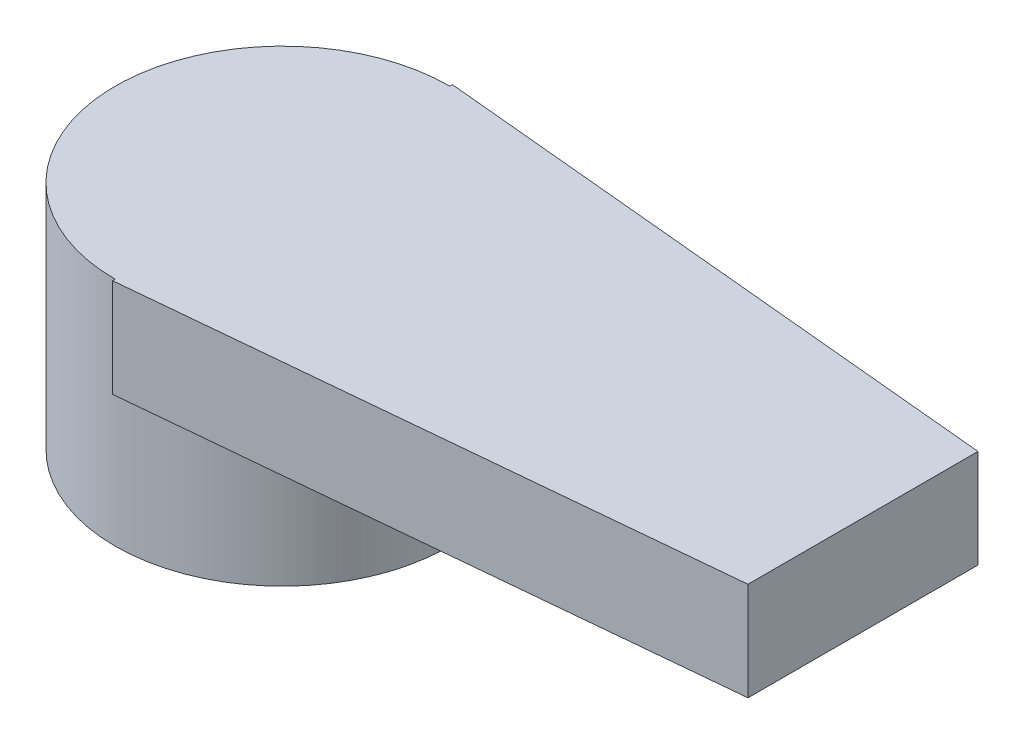
ISO-10303-21;
HEADER;
FILE_DESCRIPTION(('STEP AP214'),'2;1');
FILE_NAME('part.step','',(''),(''),'','','');
FILE_SCHEMA(('AUTOMOTIVE_DESIGN { 1 0 10303 214 1 1 1 1 }'));
ENDSEC;
DATA;
#1=APPLICATION_CONTEXT('core data for automotive mechanical design processes');
#2=APPLICATION_PROTOCOL_DEFINITION('international standard','automotive_design',2000,#1);
#3=PRODUCT_CONTEXT('',#1,'mechanical');
#4=PRODUCT('Part','Part','',(#3));
#5=PRODUCT_RELATED_PRODUCT_CATEGORY('part','',(#4));
#6=PRODUCT_DEFINITION_FORMATION('','',#4);
#7=PRODUCT_DEFINITION_CONTEXT('part definition',#1,'design');
#8=PRODUCT_DEFINITION('design','',#6,#7);
#9=PRODUCT_DEFINITION_SHAPE('','',#8);
#10=(LENGTH_UNIT() NAMED_UNIT(*) SI_UNIT(.MILLI.,.METRE.));
#11=(NAMED_UNIT(*) PLANE_ANGLE_UNIT() SI_UNIT($,.RADIAN.));
#12=(NAMED_UNIT(*) SI_UNIT($,.STERADIAN.) SOLID_ANGLE_UNIT());
#13=UNCERTAINTY_MEASURE_WITH_UNIT(LENGTH_MEASURE(1.E-05),#10,'distance_accuracy_value','');
#14=(GEOMETRIC_REPRESENTATION_CONTEXT(3) GLOBAL_UNCERTAINTY_ASSIGNED_CONTEXT((#13)) GLOBAL_UNIT_ASSIGNED_CONTEXT((#10,
#11,#12)) REPRESENTATION_CONTEXT('',''));
#15=CARTESIAN_POINT('',(0.,0.,0.));
#16=DIRECTION('',(0.,0.,1.));
#17=DIRECTION('',(1.,0.,0.));
#18=AXIS2_PLACEMENT_3D('',#15,#16,#17);
#19=CARTESIAN_POINT('',(0.,21.65,0.));
#20=DIRECTION('',(0.,-1.,0.));
#21=DIRECTION('',(0.,0.,-1.));
#22=AXIS2_PLACEMENT_3D('',#19,#20,#21);
#23=CYLINDRICAL_SURFACE('',#22,3.4);
#24=CARTESIAN_POINT('',(0.,16.95,0.));
#25=DIRECTION('',(0.,1.,0.));
#26=DIRECTION('',(0.,0.,1.));
#27=AXIS2_PLACEMENT_3D('',#24,#25,#26);
#28=CIRCLE('',#27,3.4);
#29=CARTESIAN_POINT('',(0.,16.95,3.4));
#30=VERTEX_POINT('',#29);
#31=EDGE_CURVE('E125',#30,#30,#28,.T.);
#32=ORIENTED_EDGE('',*,*,#31,.T.);
#33=EDGE_LOOP('',(#32));
#34=FACE_BOUND('',#33,.T.);
#35=DIRECTION('',(0.,-1.,0.));
#36=VECTOR('',#35,1.);
#37=CARTESIAN_POINT('',(0.,21.65,3.4));
#38=LINE('',#37,#36);
#39=CARTESIAN_POINT('',(0.,21.65,3.4));
#40=VERTEX_POINT('',#39);
#41=CARTESIAN_POINT('',(0.,19.65,3.4));
#42=VERTEX_POINT('',#41);
#43=EDGE_CURVE('E117',#40,#42,#38,.T.);
#44=ORIENTED_EDGE('',*,*,#43,.F.);
#45=CARTESIAN_POINT('',(0.,21.65,0.));
#46=DIRECTION('',(0.,1.,0.));
#47=DIRECTION('',(0.,0.,1.));
#48=AXIS2_PLACEMENT_3D('',#45,#46,#47);
#49=CIRCLE('',#48,3.4);
#50=CARTESIAN_POINT('',(0.,21.65,-3.4));
#51=VERTEX_POINT('',#50);
#52=EDGE_CURVE('E47',#51,#40,#49,.T.);
#53=ORIENTED_EDGE('',*,*,#52,.F.);
#54=DIRECTION('',(0.,-1.,0.));
#55=VECTOR('',#54,1.);
#56=CARTESIAN_POINT('',(0.,21.65,-3.4));
#57=LINE('',#56,#55);
#58=CARTESIAN_POINT('',(0.,19.65,-3.4));
#59=VERTEX_POINT('',#58);
#60=EDGE_CURVE('E113',#59,#51,#57,.F.);
#61=ORIENTED_EDGE('',*,*,#60,.F.);
#62=CARTESIAN_POINT('',(0.,19.65,0.));
#63=DIRECTION('',(0.,-1.,0.));
#64=DIRECTION('',(0.,0.,-1.));
#65=AXIS2_PLACEMENT_3D('',#62,#63,#64);
#66=CIRCLE('',#65,3.4);
#67=EDGE_CURVE('E11',#59,#42,#66,.T.);
#68=ORIENTED_EDGE('',*,*,#67,.T.);
#69=EDGE_LOOP('',(#44,#53,#61,#68));
#70=FACE_BOUND('',#69,.T.);
#71=ADVANCED_FACE('F39',(#34,#70),#23,.T.);
#72=CARTESIAN_POINT('',(0.,21.65,0.));
#73=DIRECTION('',(0.,1.,0.));
#74=DIRECTION('',(0.,0.,1.));
#75=AXIS2_PLACEMENT_3D('',#72,#73,#74);
#76=PLANE('',#75);
#77=ORIENTED_EDGE('',*,*,#52,.T.);
#78=DIRECTION('',(0.,0.,1.));
#79=VECTOR('',#78,1.);
#80=CARTESIAN_POINT('',(0.,21.65,3.45311618846922));
#81=LINE('',#80,#79);
#82=CARTESIAN_POINT('',(0.,21.65,3.45311618846922));
#83=VERTEX_POINT('',#82);
#84=EDGE_CURVE('E61',#40,#83,#81,.T.);
#85=ORIENTED_EDGE('',*,*,#84,.T.);
#86=DIRECTION('',(0.99556196460308,0.,-0.0941083133185143));
#87=VECTOR('',#86,1.);
#88=CARTESIAN_POINT('',(11.8,21.65,2.33768778055369));
#89=LINE('',#88,#87);
#90=CARTESIAN_POINT('',(11.8,21.65,2.33768778055369));
#91=VERTEX_POINT('',#90);
#92=EDGE_CURVE('E93',#83,#91,#89,.T.);
#93=ORIENTED_EDGE('',*,*,#92,.T.);
#94=DIRECTION('',(0.,0.,-1.));
#95=VECTOR('',#94,1.);
#96=CARTESIAN_POINT('',(11.8,21.65,-2.33768778055369));
#97=LINE('',#96,#95);
#98=CARTESIAN_POINT('',(11.8,21.65,-2.33768778055369));
#99=VERTEX_POINT('',#98);
#100=EDGE_CURVE('E109',#91,#99,#97,.T.);
#101=ORIENTED_EDGE('',*,*,#100,.T.);
#102=DIRECTION('',(-0.99556196460308,0.,-0.0941083133185143));
#103=VECTOR('',#102,1.);
#104=CARTESIAN_POINT('',(0.,21.65,-3.45311618846922));
#105=LINE('',#104,#103);
#106=CARTESIAN_POINT('',(0.,21.65,-3.45311618846922));
#107=VERTEX_POINT('',#106);
#108=EDGE_CURVE('E244',#99,#107,#105,.T.);
#109=ORIENTED_EDGE('',*,*,#108,.T.);
#110=EDGE_CURVE('E98',#107,#51,#81,.T.);
#111=ORIENTED_EDGE('',*,*,#110,.T.);
#112=EDGE_LOOP('',(#77,#85,#93,#101,#109,#111));
#113=FACE_BOUND('',#112,.T.);
#114=ADVANCED_FACE('F92',(#113),#76,.T.);
#115=CARTESIAN_POINT('',(0.,16.95,0.));
#116=DIRECTION('',(0.,1.,0.));
#117=DIRECTION('',(0.,0.,1.));
#118=AXIS2_PLACEMENT_3D('',#115,#116,#117);
#119=PLANE('',#118);
#120=CARTESIAN_POINT('',(0.,16.95,0.));
#121=DIRECTION('',(0.,1.,0.));
#122=DIRECTION('',(0.,0.,1.));
#123=AXIS2_PLACEMENT_3D('',#120,#121,#122);
#124=CIRCLE('',#123,2.45);
#125=CARTESIAN_POINT('',(0.,16.95,2.45));
#126=VERTEX_POINT('',#125);
#127=EDGE_CURVE('E236',#126,#126,#124,.T.);
#128=ORIENTED_EDGE('',*,*,#127,.T.);
#129=EDGE_LOOP('',(#128));
#130=FACE_BOUND('',#129,.T.);
#131=ORIENTED_EDGE('',*,*,#31,.F.);
#132=EDGE_LOOP('',(#131));
#133=FACE_BOUND('',#132,.T.);
#134=ADVANCED_FACE('F133',(#130,#133),#119,.F.);
#135=CARTESIAN_POINT('',(0.,21.65,3.45311618846922));
#136=DIRECTION('',(1.,0.,0.));
#137=DIRECTION('',(0.,0.,-1.));
#138=AXIS2_PLACEMENT_3D('',#135,#136,#137);
#139=PLANE('',#138);
#140=ORIENTED_EDGE('',*,*,#84,.F.);
#141=ORIENTED_EDGE('',*,*,#43,.T.);
#142=DIRECTION('',(0.,0.,1.));
#143=VECTOR('',#142,1.);
#144=CARTESIAN_POINT('',(0.,19.65,3.45311618846922));
#145=LINE('',#144,#143);
#146=CARTESIAN_POINT('',(0.,19.65,3.45311618846922));
#147=VERTEX_POINT('',#146);
#148=EDGE_CURVE('E54',#42,#147,#145,.T.);
#149=ORIENTED_EDGE('',*,*,#148,.T.);
#150=DIRECTION('',(0.,-1.,0.));
#151=VECTOR('',#150,1.);
#152=CARTESIAN_POINT('',(0.,21.65,3.45311618846922));
#153=LINE('',#152,#151);
#154=EDGE_CURVE('E104',#83,#147,#153,.T.);
#155=ORIENTED_EDGE('',*,*,#154,.F.);
#156=EDGE_LOOP('',(#140,#141,#149,#155));
#157=FACE_BOUND('',#156,.T.);
#158=ADVANCED_FACE('F111',(#157),#139,.F.);
#159=CARTESIAN_POINT('',(0.,19.65,-3.45311618846922));
#160=VERTEX_POINT('',#159);
#161=EDGE_CURVE('E248',#160,#59,#145,.T.);
#162=ORIENTED_EDGE('',*,*,#161,.T.);
#163=ORIENTED_EDGE('',*,*,#60,.T.);
#164=ORIENTED_EDGE('',*,*,#110,.F.);
#165=DIRECTION('',(0.,-1.,0.));
#166=VECTOR('',#165,1.);
#167=CARTESIAN_POINT('',(0.,21.65,-3.45311618846922));
#168=LINE('',#167,#166);
#169=EDGE_CURVE('E247',#107,#160,#168,.T.);
#170=ORIENTED_EDGE('',*,*,#169,.T.);
#171=EDGE_LOOP('',(#162,#163,#164,#170));
#172=FACE_BOUND('',#171,.T.);
#173=ADVANCED_FACE('F140',(#172),#139,.F.);
#174=CARTESIAN_POINT('',(11.8,21.65,2.33768778055369));
#175=DIRECTION('',(-0.0941083133185143,0.,-0.99556196460308));
#176=DIRECTION('',(-0.99556196460308,0.,0.0941083133185143));
#177=AXIS2_PLACEMENT_3D('',#174,#175,#176);
#178=PLANE('',#177);
#179=DIRECTION('',(0.99556196460308,0.,-0.0941083133185143));
#180=VECTOR('',#179,1.);
#181=CARTESIAN_POINT('',(11.8,19.65,2.33768778055369));
#182=LINE('',#181,#180);
#183=CARTESIAN_POINT('',(11.8,19.65,2.33768778055369));
#184=VERTEX_POINT('',#183);
#185=EDGE_CURVE('E252',#147,#184,#182,.T.);
#186=ORIENTED_EDGE('',*,*,#185,.T.);
#187=DIRECTION('',(0.,-1.,0.));
#188=VECTOR('',#187,1.);
#189=CARTESIAN_POINT('',(11.8,21.65,2.33768778055369));
#190=LINE('',#189,#188);
#191=EDGE_CURVE('E106',#91,#184,#190,.T.);
#192=ORIENTED_EDGE('',*,*,#191,.F.);
#193=ORIENTED_EDGE('',*,*,#92,.F.);
#194=ORIENTED_EDGE('',*,*,#154,.T.);
#195=EDGE_LOOP('',(#186,#192,#193,#194));
#196=FACE_BOUND('',#195,.T.);
#197=ADVANCED_FACE('F103',(#196),#178,.F.);
#198=CARTESIAN_POINT('',(11.8,21.65,-2.33768778055369));
#199=DIRECTION('',(-1.,0.,0.));
#200=DIRECTION('',(0.,0.,1.));
#201=AXIS2_PLACEMENT_3D('',#198,#199,#200);
#202=PLANE('',#201);
#203=DIRECTION('',(0.,0.,-1.));
#204=VECTOR('',#203,1.);
#205=CARTESIAN_POINT('',(11.8,19.65,-2.33768778055369));
#206=LINE('',#205,#204);
#207=CARTESIAN_POINT('',(11.8,19.65,-2.33768778055369));
#208=VERTEX_POINT('',#207);
#209=EDGE_CURVE('E255',#184,#208,#206,.T.);
#210=ORIENTED_EDGE('',*,*,#209,.T.);
#211=DIRECTION('',(0.,-1.,0.));
#212=VECTOR('',#211,1.);
#213=CARTESIAN_POINT('',(11.8,21.65,-2.33768778055369));
#214=LINE('',#213,#212);
#215=EDGE_CURVE('E119',#99,#208,#214,.T.);
#216=ORIENTED_EDGE('',*,*,#215,.F.);
#217=ORIENTED_EDGE('',*,*,#100,.F.);
#218=ORIENTED_EDGE('',*,*,#191,.T.);
#219=EDGE_LOOP('',(#210,#216,#217,#218));
#220=FACE_BOUND('',#219,.T.);
#221=ADVANCED_FACE('F175',(#220),#202,.F.);
#222=CARTESIAN_POINT('',(0.,21.65,-3.45311618846922));
#223=DIRECTION('',(-0.0941083133185143,0.,0.99556196460308));
#224=DIRECTION('',(0.99556196460308,0.,0.0941083133185143));
#225=AXIS2_PLACEMENT_3D('',#222,#223,#224);
#226=PLANE('',#225);
#227=DIRECTION('',(-0.99556196460308,0.,-0.0941083133185143));
#228=VECTOR('',#227,1.);
#229=CARTESIAN_POINT('',(0.,19.65,-3.45311618846922));
#230=LINE('',#229,#228);
#231=EDGE_CURVE('E99',#208,#160,#230,.T.);
#232=ORIENTED_EDGE('',*,*,#231,.T.);
#233=ORIENTED_EDGE('',*,*,#169,.F.);
#234=ORIENTED_EDGE('',*,*,#108,.F.);
#235=ORIENTED_EDGE('',*,*,#215,.T.);
#236=EDGE_LOOP('',(#232,#233,#234,#235));
#237=FACE_BOUND('',#236,.T.);
#238=ADVANCED_FACE('F184',(#237),#226,.F.);
#239=CARTESIAN_POINT('',(0.,19.65,0.));
#240=DIRECTION('',(0.,-1.,0.));
#241=DIRECTION('',(0.,0.,-1.));
#242=AXIS2_PLACEMENT_3D('',#239,#240,#241);
#243=PLANE('',#242);
#244=ORIENTED_EDGE('',*,*,#67,.F.);
#245=ORIENTED_EDGE('',*,*,#161,.F.);
#246=ORIENTED_EDGE('',*,*,#231,.F.);
#247=ORIENTED_EDGE('',*,*,#209,.F.);
#248=ORIENTED_EDGE('',*,*,#185,.F.);
#249=ORIENTED_EDGE('',*,*,#148,.F.);
#250=EDGE_LOOP('',(#244,#245,#246,#247,#248,#249));
#251=FACE_BOUND('',#250,.T.);
#252=ADVANCED_FACE('F194',(#251),#243,.T.);
#253=CARTESIAN_POINT('',(0.,16.95,0.));
#254=DIRECTION('',(0.,1.,0.));
#255=DIRECTION('',(0.,0.,1.));
#256=AXIS2_PLACEMENT_3D('',#253,#254,#255);
#257=CYLINDRICAL_SURFACE('',#256,2.45);
#258=ORIENTED_EDGE('',*,*,#127,.F.);
#259=EDGE_LOOP('',(#258));
#260=FACE_BOUND('',#259,.T.);
#261=CARTESIAN_POINT('',(0.,19.65,0.));
#262=DIRECTION('',(0.,1.,0.));
#263=DIRECTION('',(0.,0.,1.));
#264=AXIS2_PLACEMENT_3D('',#261,#262,#263);
#265=CIRCLE('',#264,2.45);
#266=CARTESIAN_POINT('',(0.,19.65,2.45));
#267=VERTEX_POINT('',#266);
#268=EDGE_CURVE('E233',#267,#267,#265,.T.);
#269=ORIENTED_EDGE('',*,*,#268,.T.);
#270=EDGE_LOOP('',(#269));
#271=FACE_BOUND('',#270,.T.);
#272=ADVANCED_FACE('F203',(#260,#271),#257,.F.);
#273=CARTESIAN_POINT('',(0.,19.65,0.));
#274=DIRECTION('',(0.,1.,0.));
#275=DIRECTION('',(0.,0.,1.));
#276=AXIS2_PLACEMENT_3D('',#273,#274,#275);
#277=PLANE('',#276);
#278=ORIENTED_EDGE('',*,*,#268,.F.);
#279=EDGE_LOOP('',(#278));
#280=FACE_BOUND('',#279,.T.);
#281=ADVANCED_FACE('F217',(#280),#277,.F.);
#282=CLOSED_SHELL('',(#71,#114,#134,#158,#173,#197,#221,#238,#252,#272,#281));
#283=MANIFOLD_SOLID_BREP('B2',#282);
#284=ADVANCED_BREP_SHAPE_REPRESENTATION('',(#18,#283),#14);
#285=SHAPE_DEFINITION_REPRESENTATION(#9,#284);
ENDSEC;
END-ISO-10303-21;
